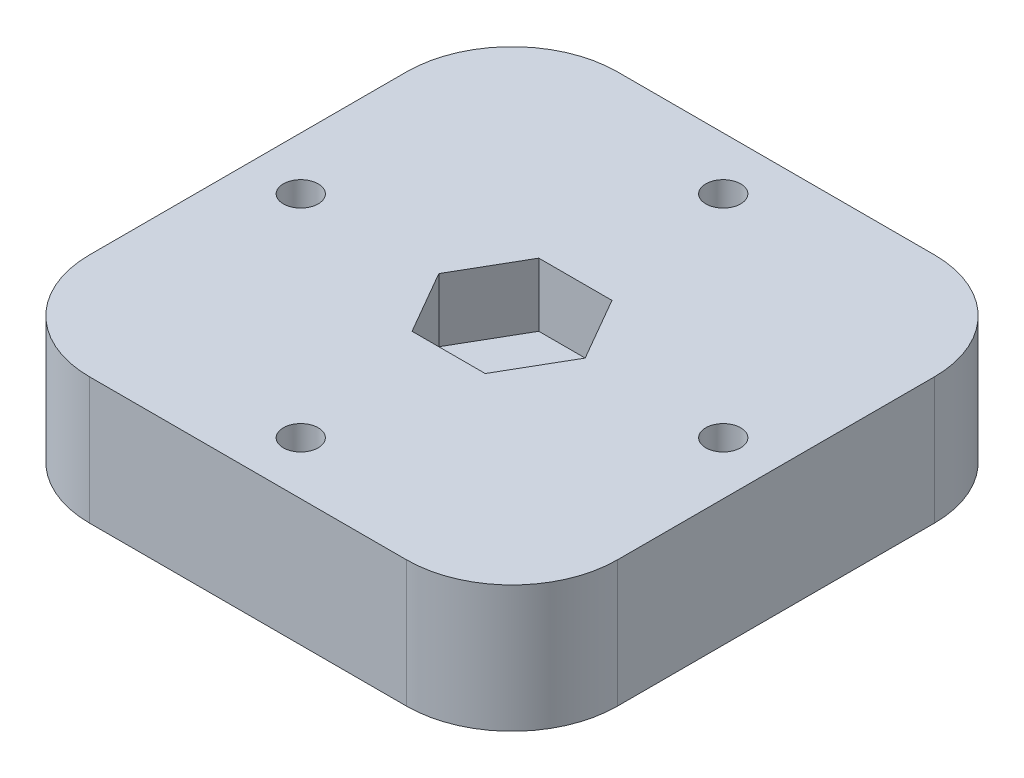
ISO-10303-21;
HEADER;
FILE_DESCRIPTION(('STEP AP214'),'2;1');
FILE_NAME('part.step','',(''),(''),'','','');
FILE_SCHEMA(('AUTOMOTIVE_DESIGN { 1 0 10303 214 1 1 1 1 }'));
ENDSEC;
DATA;
#1=APPLICATION_CONTEXT('core data for automotive mechanical design processes');
#2=APPLICATION_PROTOCOL_DEFINITION('international standard','automotive_design',2000,#1);
#3=PRODUCT_CONTEXT('',#1,'mechanical');
#4=PRODUCT('Part','Part','',(#3));
#5=PRODUCT_RELATED_PRODUCT_CATEGORY('part','',(#4));
#6=PRODUCT_DEFINITION_FORMATION('','',#4);
#7=PRODUCT_DEFINITION_CONTEXT('part definition',#1,'design');
#8=PRODUCT_DEFINITION('design','',#6,#7);
#9=PRODUCT_DEFINITION_SHAPE('','',#8);
#10=(LENGTH_UNIT() NAMED_UNIT(*) SI_UNIT(.MILLI.,.METRE.));
#11=(NAMED_UNIT(*) PLANE_ANGLE_UNIT() SI_UNIT($,.RADIAN.));
#12=(NAMED_UNIT(*) SI_UNIT($,.STERADIAN.) SOLID_ANGLE_UNIT());
#13=UNCERTAINTY_MEASURE_WITH_UNIT(LENGTH_MEASURE(1.E-05),#10,'distance_accuracy_value','');
#14=(GEOMETRIC_REPRESENTATION_CONTEXT(3) GLOBAL_UNCERTAINTY_ASSIGNED_CONTEXT((#13)) GLOBAL_UNIT_ASSIGNED_CONTEXT((#10,
#11,#12)) REPRESENTATION_CONTEXT('',''));
#15=CARTESIAN_POINT('',(0.,0.,0.));
#16=DIRECTION('',(0.,0.,1.));
#17=DIRECTION('',(1.,0.,0.));
#18=AXIS2_PLACEMENT_3D('',#15,#16,#17);
#19=CARTESIAN_POINT('',(25.,12.,-25.));
#20=DIRECTION('',(-1.,0.,0.));
#21=DIRECTION('',(0.,0.,1.));
#22=AXIS2_PLACEMENT_3D('',#19,#20,#21);
#23=PLANE('',#22);
#24=DIRECTION('',(0.,0.,-1.));
#25=VECTOR('',#24,1.);
#26=CARTESIAN_POINT('',(25.,0.,-25.));
#27=LINE('',#26,#25);
#28=CARTESIAN_POINT('',(25.,0.,15.));
#29=VERTEX_POINT('',#28);
#30=CARTESIAN_POINT('',(25.,0.,-15.));
#31=VERTEX_POINT('',#30);
#32=EDGE_CURVE('E197',#29,#31,#27,.T.);
#33=ORIENTED_EDGE('',*,*,#32,.T.);
#34=DIRECTION('',(0.,-1.,0.));
#35=VECTOR('',#34,1.);
#36=CARTESIAN_POINT('',(25.,12.,-15.));
#37=LINE('',#36,#35);
#38=CARTESIAN_POINT('',(25.,12.,-15.));
#39=VERTEX_POINT('',#38);
#40=EDGE_CURVE('E254',#31,#39,#37,.F.);
#41=ORIENTED_EDGE('',*,*,#40,.T.);
#42=DIRECTION('',(0.,0.,-1.));
#43=VECTOR('',#42,1.);
#44=CARTESIAN_POINT('',(25.,12.,-25.));
#45=LINE('',#44,#43);
#46=CARTESIAN_POINT('',(25.,12.,15.));
#47=VERTEX_POINT('',#46);
#48=EDGE_CURVE('E205',#47,#39,#45,.T.);
#49=ORIENTED_EDGE('',*,*,#48,.F.);
#50=DIRECTION('',(0.,-1.,0.));
#51=VECTOR('',#50,1.);
#52=CARTESIAN_POINT('',(25.,12.,15.));
#53=LINE('',#52,#51);
#54=EDGE_CURVE('E251',#47,#29,#53,.T.);
#55=ORIENTED_EDGE('',*,*,#54,.T.);
#56=EDGE_LOOP('',(#33,#41,#49,#55));
#57=FACE_BOUND('',#56,.T.);
#58=ADVANCED_FACE('F38',(#57),#23,.F.);
#59=CARTESIAN_POINT('',(-25.,12.,-25.));
#60=DIRECTION('',(0.,0.,1.));
#61=DIRECTION('',(1.,0.,0.));
#62=AXIS2_PLACEMENT_3D('',#59,#60,#61);
#63=PLANE('',#62);
#64=DIRECTION('',(-1.,0.,0.));
#65=VECTOR('',#64,1.);
#66=CARTESIAN_POINT('',(-25.,12.,-25.));
#67=LINE('',#66,#65);
#68=CARTESIAN_POINT('',(15.,12.,-25.));
#69=VERTEX_POINT('',#68);
#70=CARTESIAN_POINT('',(-15.,12.,-25.));
#71=VERTEX_POINT('',#70);
#72=EDGE_CURVE('E208',#69,#71,#67,.T.);
#73=ORIENTED_EDGE('',*,*,#72,.F.);
#74=DIRECTION('',(0.,-1.,0.));
#75=VECTOR('',#74,1.);
#76=CARTESIAN_POINT('',(15.,12.,-25.));
#77=LINE('',#76,#75);
#78=CARTESIAN_POINT('',(15.,0.,-25.));
#79=VERTEX_POINT('',#78);
#80=EDGE_CURVE('E240',#69,#79,#77,.T.);
#81=ORIENTED_EDGE('',*,*,#80,.T.);
#82=DIRECTION('',(-1.,0.,0.));
#83=VECTOR('',#82,1.);
#84=CARTESIAN_POINT('',(-25.,0.,-25.));
#85=LINE('',#84,#83);
#86=CARTESIAN_POINT('',(-15.,0.,-25.));
#87=VERTEX_POINT('',#86);
#88=EDGE_CURVE('E219',#79,#87,#85,.T.);
#89=ORIENTED_EDGE('',*,*,#88,.T.);
#90=DIRECTION('',(0.,-1.,0.));
#91=VECTOR('',#90,1.);
#92=CARTESIAN_POINT('',(-15.,12.,-25.));
#93=LINE('',#92,#91);
#94=EDGE_CURVE('E216',#87,#71,#93,.F.);
#95=ORIENTED_EDGE('',*,*,#94,.T.);
#96=EDGE_LOOP('',(#73,#81,#89,#95));
#97=FACE_BOUND('',#96,.T.);
#98=ADVANCED_FACE('F299',(#97),#63,.F.);
#99=CARTESIAN_POINT('',(-25.,12.,-25.));
#100=DIRECTION('',(1.,0.,0.));
#101=DIRECTION('',(0.,0.,-1.));
#102=AXIS2_PLACEMENT_3D('',#99,#100,#101);
#103=PLANE('',#102);
#104=DIRECTION('',(0.,0.,1.));
#105=VECTOR('',#104,1.);
#106=CARTESIAN_POINT('',(-25.,0.,-25.));
#107=LINE('',#106,#105);
#108=CARTESIAN_POINT('',(-25.,0.,-15.));
#109=VERTEX_POINT('',#108);
#110=CARTESIAN_POINT('',(-25.,0.,15.));
#111=VERTEX_POINT('',#110);
#112=EDGE_CURVE('E222',#109,#111,#107,.T.);
#113=ORIENTED_EDGE('',*,*,#112,.T.);
#114=DIRECTION('',(0.,-1.,0.));
#115=VECTOR('',#114,1.);
#116=CARTESIAN_POINT('',(-25.,12.,15.));
#117=LINE('',#116,#115);
#118=CARTESIAN_POINT('',(-25.,12.,15.));
#119=VERTEX_POINT('',#118);
#120=EDGE_CURVE('E11',#111,#119,#117,.F.);
#121=ORIENTED_EDGE('',*,*,#120,.T.);
#122=DIRECTION('',(0.,0.,1.));
#123=VECTOR('',#122,1.);
#124=CARTESIAN_POINT('',(-25.,12.,-25.));
#125=LINE('',#124,#123);
#126=CARTESIAN_POINT('',(-25.,12.,-15.));
#127=VERTEX_POINT('',#126);
#128=EDGE_CURVE('E212',#127,#119,#125,.T.);
#129=ORIENTED_EDGE('',*,*,#128,.F.);
#130=DIRECTION('',(0.,-1.,0.));
#131=VECTOR('',#130,1.);
#132=CARTESIAN_POINT('',(-25.,12.,-15.));
#133=LINE('',#132,#131);
#134=EDGE_CURVE('E47',#127,#109,#133,.T.);
#135=ORIENTED_EDGE('',*,*,#134,.T.);
#136=EDGE_LOOP('',(#113,#121,#129,#135));
#137=FACE_BOUND('',#136,.T.);
#138=ADVANCED_FACE('F272',(#137),#103,.F.);
#139=CARTESIAN_POINT('',(-25.,12.,25.));
#140=DIRECTION('',(0.,0.,-1.));
#141=DIRECTION('',(-1.,0.,0.));
#142=AXIS2_PLACEMENT_3D('',#139,#140,#141);
#143=PLANE('',#142);
#144=DIRECTION('',(1.,0.,0.));
#145=VECTOR('',#144,1.);
#146=CARTESIAN_POINT('',(-25.,0.,25.));
#147=LINE('',#146,#145);
#148=CARTESIAN_POINT('',(-15.,0.,25.));
#149=VERTEX_POINT('',#148);
#150=CARTESIAN_POINT('',(15.,0.,25.));
#151=VERTEX_POINT('',#150);
#152=EDGE_CURVE('E209',#149,#151,#147,.T.);
#153=ORIENTED_EDGE('',*,*,#152,.T.);
#154=DIRECTION('',(0.,-1.,0.));
#155=VECTOR('',#154,1.);
#156=CARTESIAN_POINT('',(15.,12.,25.));
#157=LINE('',#156,#155);
#158=CARTESIAN_POINT('',(15.,12.,25.));
#159=VERTEX_POINT('',#158);
#160=EDGE_CURVE('E54',#151,#159,#157,.F.);
#161=ORIENTED_EDGE('',*,*,#160,.T.);
#162=DIRECTION('',(1.,0.,0.));
#163=VECTOR('',#162,1.);
#164=CARTESIAN_POINT('',(-25.,12.,25.));
#165=LINE('',#164,#163);
#166=CARTESIAN_POINT('',(-15.,12.,25.));
#167=VERTEX_POINT('',#166);
#168=EDGE_CURVE('E214',#167,#159,#165,.T.);
#169=ORIENTED_EDGE('',*,*,#168,.F.);
#170=DIRECTION('',(0.,-1.,0.));
#171=VECTOR('',#170,1.);
#172=CARTESIAN_POINT('',(-15.,12.,25.));
#173=LINE('',#172,#171);
#174=EDGE_CURVE('E263',#167,#149,#173,.T.);
#175=ORIENTED_EDGE('',*,*,#174,.T.);
#176=EDGE_LOOP('',(#153,#161,#169,#175));
#177=FACE_BOUND('',#176,.T.);
#178=ADVANCED_FACE('F283',(#177),#143,.F.);
#179=CARTESIAN_POINT('',(0.,12.,0.));
#180=DIRECTION('',(0.,1.,0.));
#181=DIRECTION('',(0.,0.,1.));
#182=AXIS2_PLACEMENT_3D('',#179,#180,#181);
#183=PLANE('',#182);
#184=CARTESIAN_POINT('',(0.,12.,-20.));
#185=DIRECTION('',(0.,1.,0.));
#186=DIRECTION('',(0.,0.,1.));
#187=AXIS2_PLACEMENT_3D('',#184,#185,#186);
#188=CIRCLE('',#187,1.65);
#189=CARTESIAN_POINT('',(0.,12.,-18.35));
#190=VERTEX_POINT('',#189);
#191=EDGE_CURVE('E231',#190,#190,#188,.T.);
#192=ORIENTED_EDGE('',*,*,#191,.F.);
#193=EDGE_LOOP('',(#192));
#194=FACE_BOUND('',#193,.T.);
#195=CARTESIAN_POINT('',(20.,12.,0.));
#196=DIRECTION('',(0.,1.,0.));
#197=DIRECTION('',(0.,0.,1.));
#198=AXIS2_PLACEMENT_3D('',#195,#196,#197);
#199=CIRCLE('',#198,1.65);
#200=CARTESIAN_POINT('',(20.,12.,1.65));
#201=VERTEX_POINT('',#200);
#202=EDGE_CURVE('E507',#201,#201,#199,.T.);
#203=ORIENTED_EDGE('',*,*,#202,.F.);
#204=EDGE_LOOP('',(#203));
#205=FACE_BOUND('',#204,.T.);
#206=CARTESIAN_POINT('',(-20.,12.,0.));
#207=DIRECTION('',(0.,1.,0.));
#208=DIRECTION('',(0.,0.,-1.));
#209=AXIS2_PLACEMENT_3D('',#206,#207,#208);
#210=CIRCLE('',#209,1.65);
#211=CARTESIAN_POINT('',(-20.,12.,-1.65));
#212=VERTEX_POINT('',#211);
#213=EDGE_CURVE('E511',#212,#212,#210,.T.);
#214=ORIENTED_EDGE('',*,*,#213,.F.);
#215=EDGE_LOOP('',(#214));
#216=FACE_BOUND('',#215,.T.);
#217=CARTESIAN_POINT('',(0.,12.,20.));
#218=DIRECTION('',(0.,1.,0.));
#219=DIRECTION('',(0.,0.,-1.));
#220=AXIS2_PLACEMENT_3D('',#217,#218,#219);
#221=CIRCLE('',#220,1.65);
#222=CARTESIAN_POINT('',(0.,12.,18.35));
#223=VERTEX_POINT('',#222);
#224=EDGE_CURVE('E172',#223,#223,#221,.T.);
#225=ORIENTED_EDGE('',*,*,#224,.F.);
#226=EDGE_LOOP('',(#225));
#227=FACE_BOUND('',#226,.T.);
#228=DIRECTION('',(0.5,0.,-0.866025403784439));
#229=VECTOR('',#228,1.);
#230=CARTESIAN_POINT('',(3.46410161513775,12.,6.));
#231=LINE('',#230,#229);
#232=CARTESIAN_POINT('',(3.46410161513775,12.,6.));
#233=VERTEX_POINT('',#232);
#234=CARTESIAN_POINT('',(6.92820323027551,12.,0.));
#235=VERTEX_POINT('',#234);
#236=EDGE_CURVE('E148',#233,#235,#231,.T.);
#237=ORIENTED_EDGE('',*,*,#236,.F.);
#238=DIRECTION('',(1.,0.,0.));
#239=VECTOR('',#238,1.);
#240=CARTESIAN_POINT('',(-3.46410161513775,12.,6.));
#241=LINE('',#240,#239);
#242=CARTESIAN_POINT('',(-3.46410161513775,12.,6.));
#243=VERTEX_POINT('',#242);
#244=EDGE_CURVE('E166',#243,#233,#241,.T.);
#245=ORIENTED_EDGE('',*,*,#244,.F.);
#246=DIRECTION('',(0.5,0.,0.866025403784438));
#247=VECTOR('',#246,1.);
#248=CARTESIAN_POINT('',(-6.92820323027551,12.,0.));
#249=LINE('',#248,#247);
#250=CARTESIAN_POINT('',(-6.92820323027551,12.,0.));
#251=VERTEX_POINT('',#250);
#252=EDGE_CURVE('E169',#251,#243,#249,.T.);
#253=ORIENTED_EDGE('',*,*,#252,.F.);
#254=DIRECTION('',(-0.5,0.,0.866025403784439));
#255=VECTOR('',#254,1.);
#256=CARTESIAN_POINT('',(-3.46410161513776,12.,-6.));
#257=LINE('',#256,#255);
#258=CARTESIAN_POINT('',(-3.46410161513776,12.,-6.));
#259=VERTEX_POINT('',#258);
#260=EDGE_CURVE('E190',#259,#251,#257,.T.);
#261=ORIENTED_EDGE('',*,*,#260,.F.);
#262=DIRECTION('',(-1.,0.,0.));
#263=VECTOR('',#262,1.);
#264=CARTESIAN_POINT('',(3.46410161513775,12.,-6.));
#265=LINE('',#264,#263);
#266=CARTESIAN_POINT('',(3.46410161513775,12.,-6.));
#267=VERTEX_POINT('',#266);
#268=EDGE_CURVE('E187',#267,#259,#265,.T.);
#269=ORIENTED_EDGE('',*,*,#268,.F.);
#270=DIRECTION('',(-0.5,0.,-0.866025403784438));
#271=VECTOR('',#270,1.);
#272=CARTESIAN_POINT('',(6.92820323027551,12.,0.));
#273=LINE('',#272,#271);
#274=EDGE_CURVE('E184',#235,#267,#273,.T.);
#275=ORIENTED_EDGE('',*,*,#274,.F.);
#276=EDGE_LOOP('',(#237,#245,#253,#261,#269,#275));
#277=FACE_BOUND('',#276,.T.);
#278=ORIENTED_EDGE('',*,*,#48,.T.);
#279=CARTESIAN_POINT('',(15.,12.,-15.));
#280=DIRECTION('',(0.,1.,0.));
#281=DIRECTION('',(0.,0.,1.));
#282=AXIS2_PLACEMENT_3D('',#279,#280,#281);
#283=CIRCLE('',#282,10.);
#284=EDGE_CURVE('E261',#39,#69,#283,.T.);
#285=ORIENTED_EDGE('',*,*,#284,.T.);
#286=ORIENTED_EDGE('',*,*,#72,.T.);
#287=CARTESIAN_POINT('',(-15.,12.,-15.));
#288=DIRECTION('',(0.,1.,0.));
#289=DIRECTION('',(0.,0.,1.));
#290=AXIS2_PLACEMENT_3D('',#287,#288,#289);
#291=CIRCLE('',#290,10.);
#292=EDGE_CURVE('E256',#71,#127,#291,.T.);
#293=ORIENTED_EDGE('',*,*,#292,.T.);
#294=ORIENTED_EDGE('',*,*,#128,.T.);
#295=CARTESIAN_POINT('',(-15.,12.,15.));
#296=DIRECTION('',(0.,1.,0.));
#297=DIRECTION('',(0.,0.,1.));
#298=AXIS2_PLACEMENT_3D('',#295,#296,#297);
#299=CIRCLE('',#298,10.);
#300=EDGE_CURVE('E61',#119,#167,#299,.T.);
#301=ORIENTED_EDGE('',*,*,#300,.T.);
#302=ORIENTED_EDGE('',*,*,#168,.T.);
#303=CARTESIAN_POINT('',(15.,12.,15.));
#304=DIRECTION('',(0.,1.,0.));
#305=DIRECTION('',(0.,0.,1.));
#306=AXIS2_PLACEMENT_3D('',#303,#304,#305);
#307=CIRCLE('',#306,10.);
#308=EDGE_CURVE('E259',#159,#47,#307,.T.);
#309=ORIENTED_EDGE('',*,*,#308,.T.);
#310=EDGE_LOOP('',(#278,#285,#286,#293,#294,#301,#302,#309));
#311=FACE_BOUND('',#310,.T.);
#312=ADVANCED_FACE('F285',(#194,#205,#216,#227,#277,#311),#183,.T.);
#313=CARTESIAN_POINT('',(0.,0.,0.));
#314=DIRECTION('',(0.,1.,0.));
#315=DIRECTION('',(0.,0.,1.));
#316=AXIS2_PLACEMENT_3D('',#313,#314,#315);
#317=PLANE('',#316);
#318=CARTESIAN_POINT('',(0.,0.,0.));
#319=DIRECTION('',(0.,1.,0.));
#320=DIRECTION('',(0.,0.,1.));
#321=AXIS2_PLACEMENT_3D('',#318,#319,#320);
#322=CIRCLE('',#321,2.);
#323=CARTESIAN_POINT('',(0.,0.,2.));
#324=VERTEX_POINT('',#323);
#325=EDGE_CURVE('E522',#324,#324,#322,.T.);
#326=ORIENTED_EDGE('',*,*,#325,.T.);
#327=EDGE_LOOP('',(#326));
#328=FACE_BOUND('',#327,.T.);
#329=CARTESIAN_POINT('',(0.,0.,-20.));
#330=DIRECTION('',(0.,1.,0.));
#331=DIRECTION('',(0.,0.,1.));
#332=AXIS2_PLACEMENT_3D('',#329,#330,#331);
#333=CIRCLE('',#332,1.65);
#334=CARTESIAN_POINT('',(0.,0.,-18.35));
#335=VERTEX_POINT('',#334);
#336=EDGE_CURVE('E185',#335,#335,#333,.T.);
#337=ORIENTED_EDGE('',*,*,#336,.T.);
#338=EDGE_LOOP('',(#337));
#339=FACE_BOUND('',#338,.T.);
#340=CARTESIAN_POINT('',(20.,0.,0.));
#341=DIRECTION('',(0.,1.,0.));
#342=DIRECTION('',(0.,0.,1.));
#343=AXIS2_PLACEMENT_3D('',#340,#341,#342);
#344=CIRCLE('',#343,1.65);
#345=CARTESIAN_POINT('',(20.,0.,1.65));
#346=VERTEX_POINT('',#345);
#347=EDGE_CURVE('E234',#346,#346,#344,.T.);
#348=ORIENTED_EDGE('',*,*,#347,.T.);
#349=EDGE_LOOP('',(#348));
#350=FACE_BOUND('',#349,.T.);
#351=CARTESIAN_POINT('',(-20.,0.,0.));
#352=DIRECTION('',(0.,1.,0.));
#353=DIRECTION('',(0.,0.,1.));
#354=AXIS2_PLACEMENT_3D('',#351,#352,#353);
#355=CIRCLE('',#354,1.65);
#356=CARTESIAN_POINT('',(-20.,0.,1.65));
#357=VERTEX_POINT('',#356);
#358=EDGE_CURVE('E230',#357,#357,#355,.T.);
#359=ORIENTED_EDGE('',*,*,#358,.T.);
#360=EDGE_LOOP('',(#359));
#361=FACE_BOUND('',#360,.T.);
#362=CARTESIAN_POINT('',(0.,0.,20.));
#363=DIRECTION('',(0.,1.,0.));
#364=DIRECTION('',(0.,0.,1.));
#365=AXIS2_PLACEMENT_3D('',#362,#363,#364);
#366=CIRCLE('',#365,1.65);
#367=CARTESIAN_POINT('',(0.,0.,21.65));
#368=VERTEX_POINT('',#367);
#369=EDGE_CURVE('E227',#368,#368,#366,.T.);
#370=ORIENTED_EDGE('',*,*,#369,.T.);
#371=EDGE_LOOP('',(#370));
#372=FACE_BOUND('',#371,.T.);
#373=ORIENTED_EDGE('',*,*,#88,.F.);
#374=CARTESIAN_POINT('',(15.,0.,-15.));
#375=DIRECTION('',(0.,1.,0.));
#376=DIRECTION('',(0.,0.,1.));
#377=AXIS2_PLACEMENT_3D('',#374,#375,#376);
#378=CIRCLE('',#377,10.);
#379=EDGE_CURVE('E249',#79,#31,#378,.F.);
#380=ORIENTED_EDGE('',*,*,#379,.T.);
#381=ORIENTED_EDGE('',*,*,#32,.F.);
#382=CARTESIAN_POINT('',(15.,0.,15.));
#383=DIRECTION('',(0.,1.,0.));
#384=DIRECTION('',(0.,0.,1.));
#385=AXIS2_PLACEMENT_3D('',#382,#383,#384);
#386=CIRCLE('',#385,10.);
#387=EDGE_CURVE('E247',#29,#151,#386,.F.);
#388=ORIENTED_EDGE('',*,*,#387,.T.);
#389=ORIENTED_EDGE('',*,*,#152,.F.);
#390=CARTESIAN_POINT('',(-15.,0.,15.));
#391=DIRECTION('',(0.,1.,0.));
#392=DIRECTION('',(0.,0.,1.));
#393=AXIS2_PLACEMENT_3D('',#390,#391,#392);
#394=CIRCLE('',#393,10.);
#395=EDGE_CURVE('E245',#149,#111,#394,.F.);
#396=ORIENTED_EDGE('',*,*,#395,.T.);
#397=ORIENTED_EDGE('',*,*,#112,.F.);
#398=CARTESIAN_POINT('',(-15.,0.,-15.));
#399=DIRECTION('',(0.,1.,0.));
#400=DIRECTION('',(0.,0.,1.));
#401=AXIS2_PLACEMENT_3D('',#398,#399,#400);
#402=CIRCLE('',#401,10.);
#403=EDGE_CURVE('E243',#109,#87,#402,.F.);
#404=ORIENTED_EDGE('',*,*,#403,.T.);
#405=EDGE_LOOP('',(#373,#380,#381,#388,#389,#396,#397,#404));
#406=FACE_BOUND('',#405,.T.);
#407=ADVANCED_FACE('F278',(#328,#339,#350,#361,#372,#406),#317,.F.);
#408=CARTESIAN_POINT('',(3.46410161513775,6.,6.));
#409=DIRECTION('',(0.866025403784439,0.,0.5));
#410=DIRECTION('',(0.5,0.,-0.866025403784439));
#411=AXIS2_PLACEMENT_3D('',#408,#409,#410);
#412=PLANE('',#411);
#413=ORIENTED_EDGE('',*,*,#236,.T.);
#414=DIRECTION('',(0.,1.,0.));
#415=VECTOR('',#414,1.);
#416=CARTESIAN_POINT('',(6.92820323027551,6.,0.));
#417=LINE('',#416,#415);
#418=CARTESIAN_POINT('',(6.92820323027551,6.,0.));
#419=VERTEX_POINT('',#418);
#420=EDGE_CURVE('E141',#419,#235,#417,.T.);
#421=ORIENTED_EDGE('',*,*,#420,.F.);
#422=DIRECTION('',(0.5,0.,-0.866025403784439));
#423=VECTOR('',#422,1.);
#424=CARTESIAN_POINT('',(3.46410161513775,6.,6.));
#425=LINE('',#424,#423);
#426=CARTESIAN_POINT('',(3.46410161513775,6.,6.));
#427=VERTEX_POINT('',#426);
#428=EDGE_CURVE('E145',#427,#419,#425,.T.);
#429=ORIENTED_EDGE('',*,*,#428,.F.);
#430=DIRECTION('',(0.,1.,0.));
#431=VECTOR('',#430,1.);
#432=CARTESIAN_POINT('',(3.46410161513775,6.,6.));
#433=LINE('',#432,#431);
#434=EDGE_CURVE('E195',#427,#233,#433,.T.);
#435=ORIENTED_EDGE('',*,*,#434,.T.);
#436=EDGE_LOOP('',(#413,#421,#429,#435));
#437=FACE_BOUND('',#436,.T.);
#438=ADVANCED_FACE('F143',(#437),#412,.F.);
#439=CARTESIAN_POINT('',(-3.46410161513775,6.,6.));
#440=DIRECTION('',(0.,0.,1.));
#441=DIRECTION('',(1.,0.,0.));
#442=AXIS2_PLACEMENT_3D('',#439,#440,#441);
#443=PLANE('',#442);
#444=ORIENTED_EDGE('',*,*,#244,.T.);
#445=ORIENTED_EDGE('',*,*,#434,.F.);
#446=DIRECTION('',(1.,0.,0.));
#447=VECTOR('',#446,1.);
#448=CARTESIAN_POINT('',(-3.46410161513775,6.,6.));
#449=LINE('',#448,#447);
#450=CARTESIAN_POINT('',(-3.46410161513775,6.,6.));
#451=VERTEX_POINT('',#450);
#452=EDGE_CURVE('E153',#451,#427,#449,.T.);
#453=ORIENTED_EDGE('',*,*,#452,.F.);
#454=DIRECTION('',(0.,1.,0.));
#455=VECTOR('',#454,1.);
#456=CARTESIAN_POINT('',(-3.46410161513775,6.,6.));
#457=LINE('',#456,#455);
#458=EDGE_CURVE('E198',#451,#243,#457,.T.);
#459=ORIENTED_EDGE('',*,*,#458,.T.);
#460=EDGE_LOOP('',(#444,#445,#453,#459));
#461=FACE_BOUND('',#460,.T.);
#462=ADVANCED_FACE('F437',(#461),#443,.F.);
#463=CARTESIAN_POINT('',(-6.92820323027551,6.,0.));
#464=DIRECTION('',(-0.866025403784439,0.,0.5));
#465=DIRECTION('',(0.5,0.,0.866025403784439));
#466=AXIS2_PLACEMENT_3D('',#463,#464,#465);
#467=PLANE('',#466);
#468=ORIENTED_EDGE('',*,*,#252,.T.);
#469=ORIENTED_EDGE('',*,*,#458,.F.);
#470=DIRECTION('',(0.5,0.,0.866025403784438));
#471=VECTOR('',#470,1.);
#472=CARTESIAN_POINT('',(-6.92820323027551,6.,0.));
#473=LINE('',#472,#471);
#474=CARTESIAN_POINT('',(-6.92820323027551,6.,0.));
#475=VERTEX_POINT('',#474);
#476=EDGE_CURVE('E180',#475,#451,#473,.T.);
#477=ORIENTED_EDGE('',*,*,#476,.F.);
#478=DIRECTION('',(0.,1.,0.));
#479=VECTOR('',#478,1.);
#480=CARTESIAN_POINT('',(-6.92820323027551,6.,0.));
#481=LINE('',#480,#479);
#482=EDGE_CURVE('E200',#475,#251,#481,.T.);
#483=ORIENTED_EDGE('',*,*,#482,.T.);
#484=EDGE_LOOP('',(#468,#469,#477,#483));
#485=FACE_BOUND('',#484,.T.);
#486=ADVANCED_FACE('F427',(#485),#467,.F.);
#487=CARTESIAN_POINT('',(-3.46410161513776,6.,-6.));
#488=DIRECTION('',(-0.866025403784439,0.,-0.5));
#489=DIRECTION('',(-0.5,0.,0.866025403784439));
#490=AXIS2_PLACEMENT_3D('',#487,#488,#489);
#491=PLANE('',#490);
#492=ORIENTED_EDGE('',*,*,#260,.T.);
#493=ORIENTED_EDGE('',*,*,#482,.F.);
#494=DIRECTION('',(-0.5,0.,0.866025403784439));
#495=VECTOR('',#494,1.);
#496=CARTESIAN_POINT('',(-3.46410161513776,6.,-6.));
#497=LINE('',#496,#495);
#498=CARTESIAN_POINT('',(-3.46410161513776,6.,-6.));
#499=VERTEX_POINT('',#498);
#500=EDGE_CURVE('E177',#499,#475,#497,.T.);
#501=ORIENTED_EDGE('',*,*,#500,.F.);
#502=DIRECTION('',(0.,1.,0.));
#503=VECTOR('',#502,1.);
#504=CARTESIAN_POINT('',(-3.46410161513776,6.,-6.));
#505=LINE('',#504,#503);
#506=EDGE_CURVE('E202',#499,#259,#505,.T.);
#507=ORIENTED_EDGE('',*,*,#506,.T.);
#508=EDGE_LOOP('',(#492,#493,#501,#507));
#509=FACE_BOUND('',#508,.T.);
#510=ADVANCED_FACE('F417',(#509),#491,.F.);
#511=CARTESIAN_POINT('',(3.46410161513775,6.,-6.));
#512=DIRECTION('',(0.,0.,-1.));
#513=DIRECTION('',(-1.,0.,0.));
#514=AXIS2_PLACEMENT_3D('',#511,#512,#513);
#515=PLANE('',#514);
#516=ORIENTED_EDGE('',*,*,#268,.T.);
#517=ORIENTED_EDGE('',*,*,#506,.F.);
#518=DIRECTION('',(-1.,0.,0.));
#519=VECTOR('',#518,1.);
#520=CARTESIAN_POINT('',(3.46410161513775,6.,-6.));
#521=LINE('',#520,#519);
#522=CARTESIAN_POINT('',(3.46410161513775,6.,-6.));
#523=VERTEX_POINT('',#522);
#524=EDGE_CURVE('E161',#523,#499,#521,.T.);
#525=ORIENTED_EDGE('',*,*,#524,.F.);
#526=DIRECTION('',(0.,1.,0.));
#527=VECTOR('',#526,1.);
#528=CARTESIAN_POINT('',(3.46410161513775,6.,-6.));
#529=LINE('',#528,#527);
#530=EDGE_CURVE('E152',#523,#267,#529,.T.);
#531=ORIENTED_EDGE('',*,*,#530,.T.);
#532=EDGE_LOOP('',(#516,#517,#525,#531));
#533=FACE_BOUND('',#532,.T.);
#534=ADVANCED_FACE('F408',(#533),#515,.F.);
#535=CARTESIAN_POINT('',(6.92820323027551,6.,0.));
#536=DIRECTION('',(0.866025403784439,0.,-0.5));
#537=DIRECTION('',(-0.5,0.,-0.866025403784439));
#538=AXIS2_PLACEMENT_3D('',#535,#536,#537);
#539=PLANE('',#538);
#540=ORIENTED_EDGE('',*,*,#274,.T.);
#541=ORIENTED_EDGE('',*,*,#530,.F.);
#542=DIRECTION('',(-0.5,0.,-0.866025403784438));
#543=VECTOR('',#542,1.);
#544=CARTESIAN_POINT('',(6.92820323027551,6.,0.));
#545=LINE('',#544,#543);
#546=EDGE_CURVE('E156',#419,#523,#545,.T.);
#547=ORIENTED_EDGE('',*,*,#546,.F.);
#548=ORIENTED_EDGE('',*,*,#420,.T.);
#549=EDGE_LOOP('',(#540,#541,#547,#548));
#550=FACE_BOUND('',#549,.T.);
#551=ADVANCED_FACE('F157',(#550),#539,.F.);
#552=CARTESIAN_POINT('',(0.,6.,0.));
#553=DIRECTION('',(0.,1.,0.));
#554=DIRECTION('',(0.,0.,1.));
#555=AXIS2_PLACEMENT_3D('',#552,#553,#554);
#556=PLANE('',#555);
#557=CARTESIAN_POINT('',(0.,6.,0.));
#558=DIRECTION('',(0.,1.,0.));
#559=DIRECTION('',(0.,0.,1.));
#560=AXIS2_PLACEMENT_3D('',#557,#558,#559);
#561=CIRCLE('',#560,2.);
#562=CARTESIAN_POINT('',(0.,6.,2.));
#563=VERTEX_POINT('',#562);
#564=EDGE_CURVE('E42',#563,#563,#561,.F.);
#565=ORIENTED_EDGE('',*,*,#564,.T.);
#566=EDGE_LOOP('',(#565));
#567=FACE_BOUND('',#566,.T.);
#568=ORIENTED_EDGE('',*,*,#428,.T.);
#569=ORIENTED_EDGE('',*,*,#546,.T.);
#570=ORIENTED_EDGE('',*,*,#524,.T.);
#571=ORIENTED_EDGE('',*,*,#500,.T.);
#572=ORIENTED_EDGE('',*,*,#476,.T.);
#573=ORIENTED_EDGE('',*,*,#452,.T.);
#574=EDGE_LOOP('',(#568,#569,#570,#571,#572,#573));
#575=FACE_BOUND('',#574,.T.);
#576=ADVANCED_FACE('F163',(#567,#575),#556,.T.);
#577=CARTESIAN_POINT('',(0.,-13.,20.));
#578=DIRECTION('',(0.,1.,0.));
#579=DIRECTION('',(0.,0.,1.));
#580=AXIS2_PLACEMENT_3D('',#577,#578,#579);
#581=CYLINDRICAL_SURFACE('',#580,1.65);
#582=ORIENTED_EDGE('',*,*,#224,.T.);
#583=EDGE_LOOP('',(#582));
#584=FACE_BOUND('',#583,.T.);
#585=ORIENTED_EDGE('',*,*,#369,.F.);
#586=EDGE_LOOP('',(#585));
#587=FACE_BOUND('',#586,.T.);
#588=ADVANCED_FACE('F357',(#584,#587),#581,.F.);
#589=CARTESIAN_POINT('',(-20.,-13.,0.));
#590=DIRECTION('',(0.,1.,0.));
#591=DIRECTION('',(0.,0.,1.));
#592=AXIS2_PLACEMENT_3D('',#589,#590,#591);
#593=CYLINDRICAL_SURFACE('',#592,1.65);
#594=ORIENTED_EDGE('',*,*,#213,.T.);
#595=EDGE_LOOP('',(#594));
#596=FACE_BOUND('',#595,.T.);
#597=ORIENTED_EDGE('',*,*,#358,.F.);
#598=EDGE_LOOP('',(#597));
#599=FACE_BOUND('',#598,.T.);
#600=ADVANCED_FACE('F384',(#596,#599),#593,.F.);
#601=CARTESIAN_POINT('',(20.,-13.,0.));
#602=DIRECTION('',(0.,1.,0.));
#603=DIRECTION('',(0.,0.,1.));
#604=AXIS2_PLACEMENT_3D('',#601,#602,#603);
#605=CYLINDRICAL_SURFACE('',#604,1.65);
#606=ORIENTED_EDGE('',*,*,#202,.T.);
#607=EDGE_LOOP('',(#606));
#608=FACE_BOUND('',#607,.T.);
#609=ORIENTED_EDGE('',*,*,#347,.F.);
#610=EDGE_LOOP('',(#609));
#611=FACE_BOUND('',#610,.T.);
#612=ADVANCED_FACE('F375',(#608,#611),#605,.F.);
#613=CARTESIAN_POINT('',(0.,-13.,-20.));
#614=DIRECTION('',(0.,1.,0.));
#615=DIRECTION('',(0.,0.,1.));
#616=AXIS2_PLACEMENT_3D('',#613,#614,#615);
#617=CYLINDRICAL_SURFACE('',#616,1.65);
#618=ORIENTED_EDGE('',*,*,#191,.T.);
#619=EDGE_LOOP('',(#618));
#620=FACE_BOUND('',#619,.T.);
#621=ORIENTED_EDGE('',*,*,#336,.F.);
#622=EDGE_LOOP('',(#621));
#623=FACE_BOUND('',#622,.T.);
#624=ADVANCED_FACE('F319',(#620,#623),#617,.F.);
#625=CARTESIAN_POINT('',(15.,12.,-15.));
#626=DIRECTION('',(0.,-1.,0.));
#627=DIRECTION('',(0.,0.,-1.));
#628=AXIS2_PLACEMENT_3D('',#625,#626,#627);
#629=CYLINDRICAL_SURFACE('',#628,10.);
#630=ORIENTED_EDGE('',*,*,#284,.F.);
#631=ORIENTED_EDGE('',*,*,#40,.F.);
#632=ORIENTED_EDGE('',*,*,#379,.F.);
#633=ORIENTED_EDGE('',*,*,#80,.F.);
#634=EDGE_LOOP('',(#630,#631,#632,#633));
#635=FACE_BOUND('',#634,.T.);
#636=ADVANCED_FACE('F296',(#635),#629,.T.);
#637=CARTESIAN_POINT('',(15.,12.,15.));
#638=DIRECTION('',(0.,-1.,0.));
#639=DIRECTION('',(0.,0.,-1.));
#640=AXIS2_PLACEMENT_3D('',#637,#638,#639);
#641=CYLINDRICAL_SURFACE('',#640,10.);
#642=ORIENTED_EDGE('',*,*,#308,.F.);
#643=ORIENTED_EDGE('',*,*,#160,.F.);
#644=ORIENTED_EDGE('',*,*,#387,.F.);
#645=ORIENTED_EDGE('',*,*,#54,.F.);
#646=EDGE_LOOP('',(#642,#643,#644,#645));
#647=FACE_BOUND('',#646,.T.);
#648=ADVANCED_FACE('F289',(#647),#641,.T.);
#649=CARTESIAN_POINT('',(-15.,12.,15.));
#650=DIRECTION('',(0.,-1.,0.));
#651=DIRECTION('',(0.,0.,-1.));
#652=AXIS2_PLACEMENT_3D('',#649,#650,#651);
#653=CYLINDRICAL_SURFACE('',#652,10.);
#654=ORIENTED_EDGE('',*,*,#300,.F.);
#655=ORIENTED_EDGE('',*,*,#120,.F.);
#656=ORIENTED_EDGE('',*,*,#395,.F.);
#657=ORIENTED_EDGE('',*,*,#174,.F.);
#658=EDGE_LOOP('',(#654,#655,#656,#657));
#659=FACE_BOUND('',#658,.T.);
#660=ADVANCED_FACE('F282',(#659),#653,.T.);
#661=CARTESIAN_POINT('',(-15.,12.,-15.));
#662=DIRECTION('',(0.,-1.,0.));
#663=DIRECTION('',(0.,0.,-1.));
#664=AXIS2_PLACEMENT_3D('',#661,#662,#663);
#665=CYLINDRICAL_SURFACE('',#664,10.);
#666=ORIENTED_EDGE('',*,*,#292,.F.);
#667=ORIENTED_EDGE('',*,*,#94,.F.);
#668=ORIENTED_EDGE('',*,*,#403,.F.);
#669=ORIENTED_EDGE('',*,*,#134,.F.);
#670=EDGE_LOOP('',(#666,#667,#668,#669));
#671=FACE_BOUND('',#670,.T.);
#672=ADVANCED_FACE('F40',(#671),#665,.T.);
#673=CARTESIAN_POINT('',(0.,10.,0.));
#674=DIRECTION('',(0.,-1.,0.));
#675=DIRECTION('',(0.,0.,-1.));
#676=AXIS2_PLACEMENT_3D('',#673,#674,#675);
#677=CYLINDRICAL_SURFACE('',#676,2.);
#678=ORIENTED_EDGE('',*,*,#564,.F.);
#679=EDGE_LOOP('',(#678));
#680=FACE_BOUND('',#679,.T.);
#681=ORIENTED_EDGE('',*,*,#325,.F.);
#682=EDGE_LOOP('',(#681));
#683=FACE_BOUND('',#682,.T.);
#684=ADVANCED_FACE('F302',(#680,#683),#677,.F.);
#685=CLOSED_SHELL('',(#58,#98,#138,#178,#312,#407,#438,#462,#486,#510,#534,#551,#576,#588,#600,
#612,#624,#636,#648,#660,#672,#684));
#686=MANIFOLD_SOLID_BREP('B2',#685);
#687=ADVANCED_BREP_SHAPE_REPRESENTATION('',(#18,#686),#14);
#688=SHAPE_DEFINITION_REPRESENTATION(#9,#687);
ENDSEC;
END-ISO-10303-21;
